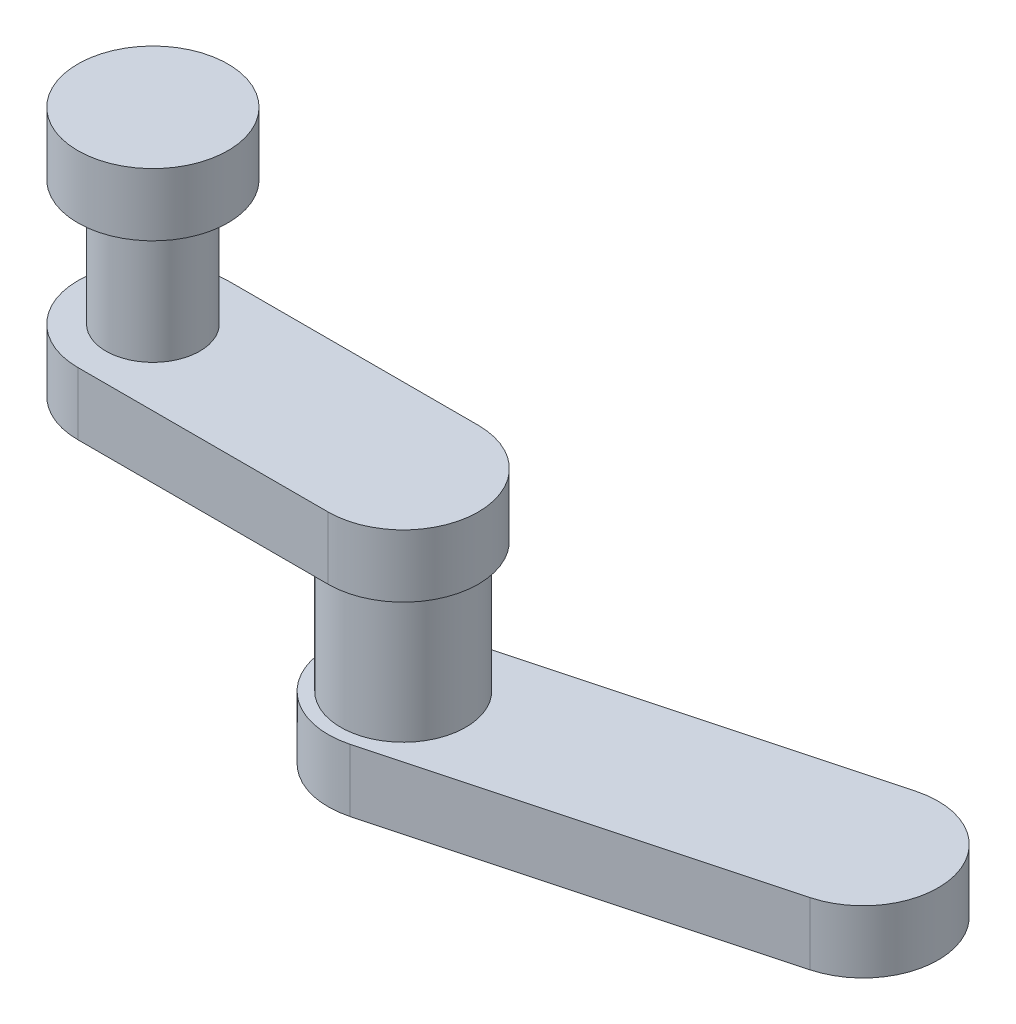
ISO-10303-21;
HEADER;
FILE_DESCRIPTION(('STEP AP214'),'2;1');
FILE_NAME('part.step','',(''),(''),'','','');
FILE_SCHEMA(('AUTOMOTIVE_DESIGN { 1 0 10303 214 1 1 1 1 }'));
ENDSEC;
DATA;
#1=APPLICATION_CONTEXT('core data for automotive mechanical design processes');
#2=APPLICATION_PROTOCOL_DEFINITION('international standard','automotive_design',2000,#1);
#3=PRODUCT_CONTEXT('',#1,'mechanical');
#4=PRODUCT('Part','Part','',(#3));
#5=PRODUCT_RELATED_PRODUCT_CATEGORY('part','',(#4));
#6=PRODUCT_DEFINITION_FORMATION('','',#4);
#7=PRODUCT_DEFINITION_CONTEXT('part definition',#1,'design');
#8=PRODUCT_DEFINITION('design','',#6,#7);
#9=PRODUCT_DEFINITION_SHAPE('','',#8);
#10=(LENGTH_UNIT() NAMED_UNIT(*) SI_UNIT(.MILLI.,.METRE.));
#11=(NAMED_UNIT(*) PLANE_ANGLE_UNIT() SI_UNIT($,.RADIAN.));
#12=(NAMED_UNIT(*) SI_UNIT($,.STERADIAN.) SOLID_ANGLE_UNIT());
#13=UNCERTAINTY_MEASURE_WITH_UNIT(LENGTH_MEASURE(1.E-05),#10,'distance_accuracy_value','');
#14=(GEOMETRIC_REPRESENTATION_CONTEXT(3) GLOBAL_UNCERTAINTY_ASSIGNED_CONTEXT((#13)) GLOBAL_UNIT_ASSIGNED_CONTEXT((#10,
#11,#12)) REPRESENTATION_CONTEXT('',''));
#15=CARTESIAN_POINT('',(0.,0.,0.));
#16=DIRECTION('',(0.,0.,1.));
#17=DIRECTION('',(1.,0.,0.));
#18=AXIS2_PLACEMENT_3D('',#15,#16,#17);
#19=CARTESIAN_POINT('',(0.,6.604,0.));
#20=DIRECTION('',(0.,-1.,0.));
#21=DIRECTION('',(0.,0.,-1.));
#22=AXIS2_PLACEMENT_3D('',#19,#20,#21);
#23=CYLINDRICAL_SURFACE('',#22,3.175);
#24=CARTESIAN_POINT('',(0.,6.604,0.));
#25=DIRECTION('',(0.,1.,0.));
#26=DIRECTION('',(0.,0.,1.));
#27=AXIS2_PLACEMENT_3D('',#24,#25,#26);
#28=CIRCLE('',#27,3.175);
#29=CARTESIAN_POINT('',(0.,6.604,-3.175));
#30=VERTEX_POINT('',#29);
#31=EDGE_CURVE('E11',#30,#30,#28,.T.);
#32=CARTESIAN_POINT('',(0.,0.,0.));
#33=DIRECTION('',(0.,1.,0.));
#34=DIRECTION('',(0.,0.,1.));
#35=AXIS2_PLACEMENT_3D('',#32,#33,#34);
#36=CIRCLE('',#35,3.175);
#37=CARTESIAN_POINT('',(0.,0.,-3.175));
#38=VERTEX_POINT('',#37);
#39=EDGE_CURVE('E44',#38,#38,#36,.T.);
#40=CARTESIAN_POINT('',(0.,6.604,-3.175));
#41=CARTESIAN_POINT('',(0.,6.53520833333333,-3.175));
#42=CARTESIAN_POINT('',(0.,6.46641666666667,-3.175));
#43=CARTESIAN_POINT('',(0.,6.32883333333333,-3.175));
#44=CARTESIAN_POINT('',(0.,6.26004166666667,-3.175));
#45=CARTESIAN_POINT('',(0.,6.12245833333333,-3.175));
#46=CARTESIAN_POINT('',(0.,6.05366666666667,-3.175));
#47=CARTESIAN_POINT('',(0.,5.91608333333333,-3.175));
#48=CARTESIAN_POINT('',(0.,5.84729166666667,-3.175));
#49=CARTESIAN_POINT('',(0.,5.70970833333333,-3.175));
#50=CARTESIAN_POINT('',(0.,5.64091666666667,-3.175));
#51=CARTESIAN_POINT('',(0.,5.50333333333333,-3.175));
#52=CARTESIAN_POINT('',(0.,5.43454166666667,-3.175));
#53=CARTESIAN_POINT('',(0.,5.29695833333333,-3.175));
#54=CARTESIAN_POINT('',(0.,5.22816666666667,-3.175));
#55=CARTESIAN_POINT('',(0.,5.09058333333333,-3.175));
#56=CARTESIAN_POINT('',(0.,5.02179166666667,-3.175));
#57=CARTESIAN_POINT('',(0.,4.88420833333333,-3.175));
#58=CARTESIAN_POINT('',(0.,4.81541666666667,-3.175));
#59=CARTESIAN_POINT('',(0.,4.67783333333333,-3.175));
#60=CARTESIAN_POINT('',(0.,4.60904166666667,-3.175));
#61=CARTESIAN_POINT('',(0.,4.47145833333333,-3.175));
#62=CARTESIAN_POINT('',(0.,4.40266666666667,-3.175));
#63=CARTESIAN_POINT('',(0.,4.26508333333333,-3.175));
#64=CARTESIAN_POINT('',(0.,4.19629166666667,-3.175));
#65=CARTESIAN_POINT('',(0.,4.05870833333333,-3.175));
#66=CARTESIAN_POINT('',(0.,3.98991666666667,-3.175));
#67=CARTESIAN_POINT('',(0.,3.85233333333333,-3.175));
#68=CARTESIAN_POINT('',(0.,3.78354166666667,-3.175));
#69=CARTESIAN_POINT('',(0.,3.64595833333333,-3.175));
#70=CARTESIAN_POINT('',(0.,3.57716666666667,-3.175));
#71=CARTESIAN_POINT('',(0.,3.43958333333333,-3.175));
#72=CARTESIAN_POINT('',(0.,3.37079166666667,-3.175));
#73=CARTESIAN_POINT('',(0.,3.23320833333333,-3.175));
#74=CARTESIAN_POINT('',(0.,3.16441666666667,-3.175));
#75=CARTESIAN_POINT('',(0.,3.02683333333333,-3.175));
#76=CARTESIAN_POINT('',(0.,2.95804166666667,-3.175));
#77=CARTESIAN_POINT('',(0.,2.82045833333333,-3.175));
#78=CARTESIAN_POINT('',(0.,2.75166666666667,-3.175));
#79=CARTESIAN_POINT('',(0.,2.61408333333333,-3.175));
#80=CARTESIAN_POINT('',(0.,2.54529166666667,-3.175));
#81=CARTESIAN_POINT('',(0.,2.40770833333333,-3.175));
#82=CARTESIAN_POINT('',(0.,2.33891666666667,-3.175));
#83=CARTESIAN_POINT('',(0.,2.20133333333333,-3.175));
#84=CARTESIAN_POINT('',(0.,2.13254166666667,-3.175));
#85=CARTESIAN_POINT('',(0.,1.99495833333333,-3.175));
#86=CARTESIAN_POINT('',(0.,1.92616666666667,-3.175));
#87=CARTESIAN_POINT('',(0.,1.78858333333333,-3.175));
#88=CARTESIAN_POINT('',(0.,1.71979166666667,-3.175));
#89=CARTESIAN_POINT('',(0.,1.58220833333333,-3.175));
#90=CARTESIAN_POINT('',(0.,1.51341666666667,-3.175));
#91=CARTESIAN_POINT('',(0.,1.37583333333333,-3.175));
#92=CARTESIAN_POINT('',(0.,1.30704166666667,-3.175));
#93=CARTESIAN_POINT('',(0.,1.16945833333333,-3.175));
#94=CARTESIAN_POINT('',(0.,1.10066666666667,-3.175));
#95=CARTESIAN_POINT('',(0.,0.963083333333333,-3.175));
#96=CARTESIAN_POINT('',(0.,0.894291666666666,-3.175));
#97=CARTESIAN_POINT('',(0.,0.756708333333333,-3.175));
#98=CARTESIAN_POINT('',(0.,0.687916666666667,-3.175));
#99=CARTESIAN_POINT('',(0.,0.550333333333333,-3.175));
#100=CARTESIAN_POINT('',(0.,0.481541666666667,-3.175));
#101=CARTESIAN_POINT('',(0.,0.343958333333333,-3.175));
#102=CARTESIAN_POINT('',(0.,0.275166666666667,-3.175));
#103=CARTESIAN_POINT('',(0.,0.137583333333333,-3.175));
#104=CARTESIAN_POINT('',(0.,0.0687916666666666,-3.175));
#105=CARTESIAN_POINT('',(0.,0.,-3.175));
#106=B_SPLINE_CURVE_WITH_KNOTS('',3,(#40,#41,#42,#43,#44,#45,#46,#47,#48,#49,#50,#51,#52,#53,
#54,#55,#56,#57,#58,#59,#60,#61,#62,#63,#64,#65,#66,#67,#68,#69,#70,#71,#72,#73,#74,#75,#76,#77,
#78,#79,#80,#81,#82,#83,#84,#85,#86,#87,#88,#89,#90,#91,#92,#93,#94,#95,#96,#97,#98,#99,#100,
#101,#102,#103,#104,#105),.UNSPECIFIED.,.F.,.F.,(4,2,2,2,2,2,2,2,2,2,2,2,2,2,2,2,2,2,2,2,2,2,2,
2,2,2,2,2,2,2,2,2,4),(0.,0.206375,0.41275,0.619125,0.8255,1.031875,1.23825,1.444625,1.651,
1.857375,2.06375,2.270125,2.4765,2.682875,2.88925,3.095625,3.302,3.508375,3.71475,3.921125,
4.1275,4.333875,4.54025,4.746625,4.953,5.159375,5.36575,5.572125,5.7785,5.984875,6.19125,
6.397625,6.604),.UNSPECIFIED.);
#107=EDGE_CURVE('BSEAM41',#30,#38,#106,.T.);
#108=ORIENTED_EDGE('',*,*,#31,.F.);
#109=ORIENTED_EDGE('',*,*,#39,.T.);
#110=ORIENTED_EDGE('',*,*,#107,.T.);
#111=ORIENTED_EDGE('',*,*,#107,.F.);
#112=EDGE_LOOP('',(#108,#110,#109,#111));
#113=FACE_BOUND('',#112,.T.);
#114=ADVANCED_FACE('F41',(#113),#23,.T.);
#115=CARTESIAN_POINT('',(0.,9.779,0.));
#116=DIRECTION('',(0.,1.,0.));
#117=DIRECTION('',(0.,0.,1.));
#118=AXIS2_PLACEMENT_3D('',#115,#116,#117);
#119=PLANE('',#118);
#120=CARTESIAN_POINT('',(0.,9.779,0.));
#121=DIRECTION('',(0.,1.,0.));
#122=DIRECTION('',(0.,0.,1.));
#123=AXIS2_PLACEMENT_3D('',#120,#121,#122);
#124=CIRCLE('',#123,3.81);
#125=CARTESIAN_POINT('',(0.,9.779,3.81));
#126=VERTEX_POINT('',#125);
#127=CARTESIAN_POINT('',(0.,9.779,-3.81));
#128=VERTEX_POINT('',#127);
#129=EDGE_CURVE('E161',#126,#128,#124,.T.);
#130=ORIENTED_EDGE('',*,*,#129,.T.);
#131=DIRECTION('',(-1.,0.,0.));
#132=VECTOR('',#131,1.);
#133=CARTESIAN_POINT('',(0.,9.779,-3.81));
#134=LINE('',#133,#132);
#135=CARTESIAN_POINT('',(-12.7,9.779,-3.81));
#136=VERTEX_POINT('',#135);
#137=EDGE_CURVE('E90',#128,#136,#134,.T.);
#138=ORIENTED_EDGE('',*,*,#137,.T.);
#139=CARTESIAN_POINT('',(-12.7,9.779,0.));
#140=DIRECTION('',(0.,1.,0.));
#141=DIRECTION('',(0.,0.,1.));
#142=AXIS2_PLACEMENT_3D('',#139,#140,#141);
#143=CIRCLE('',#142,3.81);
#144=CARTESIAN_POINT('',(-12.7,9.779,3.81));
#145=VERTEX_POINT('',#144);
#146=EDGE_CURVE('E164',#136,#145,#143,.T.);
#147=ORIENTED_EDGE('',*,*,#146,.T.);
#148=DIRECTION('',(1.,0.,0.));
#149=VECTOR('',#148,1.);
#150=CARTESIAN_POINT('',(0.,9.779,3.81));
#151=LINE('',#150,#149);
#152=EDGE_CURVE('E58',#145,#126,#151,.T.);
#153=ORIENTED_EDGE('',*,*,#152,.T.);
#154=EDGE_LOOP('',(#130,#138,#147,#153));
#155=FACE_BOUND('',#154,.T.);
#156=CARTESIAN_POINT('',(-12.7,9.779,0.));
#157=DIRECTION('',(0.,1.,0.));
#158=DIRECTION('',(0.,0.,1.));
#159=AXIS2_PLACEMENT_3D('',#156,#157,#158);
#160=CIRCLE('',#159,2.38125);
#161=CARTESIAN_POINT('',(-12.7,9.779,-2.38125));
#162=VERTEX_POINT('',#161);
#163=EDGE_CURVE('E157',#162,#162,#160,.T.);
#164=ORIENTED_EDGE('',*,*,#163,.F.);
#165=EDGE_LOOP('',(#164));
#166=FACE_BOUND('',#165,.T.);
#167=ADVANCED_FACE('F188',(#155,#166),#119,.T.);
#168=CARTESIAN_POINT('',(0.,6.604,0.));
#169=DIRECTION('',(0.,1.,0.));
#170=DIRECTION('',(0.,0.,1.));
#171=AXIS2_PLACEMENT_3D('',#168,#169,#170);
#172=PLANE('',#171);
#173=ORIENTED_EDGE('',*,*,#31,.T.);
#174=EDGE_LOOP('',(#173));
#175=FACE_BOUND('',#174,.T.);
#176=CARTESIAN_POINT('',(0.,6.604,0.));
#177=DIRECTION('',(0.,1.,0.));
#178=DIRECTION('',(0.,0.,1.));
#179=AXIS2_PLACEMENT_3D('',#176,#177,#178);
#180=CIRCLE('',#179,3.81);
#181=CARTESIAN_POINT('',(0.,6.604,3.81));
#182=VERTEX_POINT('',#181);
#183=CARTESIAN_POINT('',(0.,6.604,-3.81));
#184=VERTEX_POINT('',#183);
#185=EDGE_CURVE('E160',#182,#184,#180,.T.);
#186=ORIENTED_EDGE('',*,*,#185,.F.);
#187=DIRECTION('',(1.,0.,0.));
#188=VECTOR('',#187,1.);
#189=CARTESIAN_POINT('',(0.,6.604,3.81));
#190=LINE('',#189,#188);
#191=CARTESIAN_POINT('',(-12.7,6.604,3.81));
#192=VERTEX_POINT('',#191);
#193=EDGE_CURVE('E82',#192,#182,#190,.T.);
#194=ORIENTED_EDGE('',*,*,#193,.F.);
#195=CARTESIAN_POINT('',(-12.7,6.604,0.));
#196=DIRECTION('',(0.,1.,0.));
#197=DIRECTION('',(0.,0.,1.));
#198=AXIS2_PLACEMENT_3D('',#195,#196,#197);
#199=CIRCLE('',#198,3.81);
#200=CARTESIAN_POINT('',(-12.7,6.604,-3.81));
#201=VERTEX_POINT('',#200);
#202=EDGE_CURVE('E76',#201,#192,#199,.T.);
#203=ORIENTED_EDGE('',*,*,#202,.F.);
#204=DIRECTION('',(-1.,0.,0.));
#205=VECTOR('',#204,1.);
#206=CARTESIAN_POINT('',(0.,6.604,-3.81));
#207=LINE('',#206,#205);
#208=EDGE_CURVE('E170',#184,#201,#207,.T.);
#209=ORIENTED_EDGE('',*,*,#208,.F.);
#210=EDGE_LOOP('',(#186,#194,#203,#209));
#211=FACE_BOUND('',#210,.T.);
#212=ADVANCED_FACE('F186',(#175,#211),#172,.F.);
#213=CARTESIAN_POINT('',(0.,9.779,0.));
#214=DIRECTION('',(0.,-1.,0.));
#215=DIRECTION('',(0.,0.,-1.));
#216=AXIS2_PLACEMENT_3D('',#213,#214,#215);
#217=CYLINDRICAL_SURFACE('',#216,3.81);
#218=ORIENTED_EDGE('',*,*,#185,.T.);
#219=DIRECTION('',(0.,-1.,0.));
#220=VECTOR('',#219,1.);
#221=CARTESIAN_POINT('',(0.,9.779,-3.81));
#222=LINE('',#221,#220);
#223=EDGE_CURVE('E50',#128,#184,#222,.T.);
#224=ORIENTED_EDGE('',*,*,#223,.F.);
#225=ORIENTED_EDGE('',*,*,#129,.F.);
#226=DIRECTION('',(0.,-1.,0.));
#227=VECTOR('',#226,1.);
#228=CARTESIAN_POINT('',(0.,9.779,3.81));
#229=LINE('',#228,#227);
#230=EDGE_CURVE('E167',#126,#182,#229,.T.);
#231=ORIENTED_EDGE('',*,*,#230,.T.);
#232=EDGE_LOOP('',(#218,#224,#225,#231));
#233=FACE_BOUND('',#232,.T.);
#234=ADVANCED_FACE('F184',(#233),#217,.T.);
#235=CARTESIAN_POINT('',(0.,9.779,-3.81));
#236=DIRECTION('',(0.,0.,1.));
#237=DIRECTION('',(1.,0.,0.));
#238=AXIS2_PLACEMENT_3D('',#235,#236,#237);
#239=PLANE('',#238);
#240=ORIENTED_EDGE('',*,*,#208,.T.);
#241=DIRECTION('',(0.,-1.,0.));
#242=VECTOR('',#241,1.);
#243=CARTESIAN_POINT('',(-12.7,9.779,-3.81));
#244=LINE('',#243,#242);
#245=EDGE_CURVE('E177',#136,#201,#244,.T.);
#246=ORIENTED_EDGE('',*,*,#245,.F.);
#247=ORIENTED_EDGE('',*,*,#137,.F.);
#248=ORIENTED_EDGE('',*,*,#223,.T.);
#249=EDGE_LOOP('',(#240,#246,#247,#248));
#250=FACE_BOUND('',#249,.T.);
#251=ADVANCED_FACE('F180',(#250),#239,.F.);
#252=CARTESIAN_POINT('',(-12.7,9.779,0.));
#253=DIRECTION('',(0.,-1.,0.));
#254=DIRECTION('',(0.,0.,-1.));
#255=AXIS2_PLACEMENT_3D('',#252,#253,#254);
#256=CYLINDRICAL_SURFACE('',#255,3.81);
#257=ORIENTED_EDGE('',*,*,#202,.T.);
#258=DIRECTION('',(0.,-1.,0.));
#259=VECTOR('',#258,1.);
#260=CARTESIAN_POINT('',(-12.7,9.779,3.81));
#261=LINE('',#260,#259);
#262=EDGE_CURVE('E175',#145,#192,#261,.T.);
#263=ORIENTED_EDGE('',*,*,#262,.F.);
#264=ORIENTED_EDGE('',*,*,#146,.F.);
#265=ORIENTED_EDGE('',*,*,#245,.T.);
#266=EDGE_LOOP('',(#257,#263,#264,#265));
#267=FACE_BOUND('',#266,.T.);
#268=ADVANCED_FACE('F257',(#267),#256,.T.);
#269=CARTESIAN_POINT('',(0.,9.779,3.81));
#270=DIRECTION('',(0.,0.,-1.));
#271=DIRECTION('',(-1.,0.,0.));
#272=AXIS2_PLACEMENT_3D('',#269,#270,#271);
#273=PLANE('',#272);
#274=ORIENTED_EDGE('',*,*,#193,.T.);
#275=ORIENTED_EDGE('',*,*,#230,.F.);
#276=ORIENTED_EDGE('',*,*,#152,.F.);
#277=ORIENTED_EDGE('',*,*,#262,.T.);
#278=EDGE_LOOP('',(#274,#275,#276,#277));
#279=FACE_BOUND('',#278,.T.);
#280=ADVANCED_FACE('F253',(#279),#273,.F.);
#281=CARTESIAN_POINT('',(-12.7,16.129,0.));
#282=DIRECTION('',(0.,-1.,0.));
#283=DIRECTION('',(0.,0.,-1.));
#284=AXIS2_PLACEMENT_3D('',#281,#282,#283);
#285=CYLINDRICAL_SURFACE('',#284,2.38125);
#286=CARTESIAN_POINT('',(-12.7,16.129,0.));
#287=DIRECTION('',(0.,1.,0.));
#288=DIRECTION('',(0.,0.,1.));
#289=AXIS2_PLACEMENT_3D('',#286,#287,#288);
#290=CIRCLE('',#289,2.38125);
#291=CARTESIAN_POINT('',(-12.7,16.129,-2.38125));
#292=VERTEX_POINT('',#291);
#293=EDGE_CURVE('E152',#292,#292,#290,.T.);
#294=CARTESIAN_POINT('',(-12.7,9.779,-2.38125));
#295=CARTESIAN_POINT('',(-12.7,9.84514583333333,-2.38125));
#296=CARTESIAN_POINT('',(-12.7,9.91129166666667,-2.38125));
#297=CARTESIAN_POINT('',(-12.7,10.0435833333333,-2.38125));
#298=CARTESIAN_POINT('',(-12.7,10.1097291666667,-2.38125));
#299=CARTESIAN_POINT('',(-12.7,10.2420208333333,-2.38125));
#300=CARTESIAN_POINT('',(-12.7,10.3081666666667,-2.38125));
#301=CARTESIAN_POINT('',(-12.7,10.4404583333333,-2.38125));
#302=CARTESIAN_POINT('',(-12.7,10.5066041666667,-2.38125));
#303=CARTESIAN_POINT('',(-12.7,10.6388958333333,-2.38125));
#304=CARTESIAN_POINT('',(-12.7,10.7050416666667,-2.38125));
#305=CARTESIAN_POINT('',(-12.7,10.8373333333333,-2.38125));
#306=CARTESIAN_POINT('',(-12.7,10.9034791666667,-2.38125));
#307=CARTESIAN_POINT('',(-12.7,11.0357708333333,-2.38125));
#308=CARTESIAN_POINT('',(-12.7,11.1019166666667,-2.38125));
#309=CARTESIAN_POINT('',(-12.7,11.2342083333333,-2.38125));
#310=CARTESIAN_POINT('',(-12.7,11.3003541666667,-2.38125));
#311=CARTESIAN_POINT('',(-12.7,11.4326458333333,-2.38125));
#312=CARTESIAN_POINT('',(-12.7,11.4987916666667,-2.38125));
#313=CARTESIAN_POINT('',(-12.7,11.6310833333333,-2.38125));
#314=CARTESIAN_POINT('',(-12.7,11.6972291666667,-2.38125));
#315=CARTESIAN_POINT('',(-12.7,11.8295208333333,-2.38125));
#316=CARTESIAN_POINT('',(-12.7,11.8956666666667,-2.38125));
#317=CARTESIAN_POINT('',(-12.7,12.0279583333333,-2.38125));
#318=CARTESIAN_POINT('',(-12.7,12.0941041666667,-2.38125));
#319=CARTESIAN_POINT('',(-12.7,12.2263958333333,-2.38125));
#320=CARTESIAN_POINT('',(-12.7,12.2925416666667,-2.38125));
#321=CARTESIAN_POINT('',(-12.7,12.4248333333333,-2.38125));
#322=CARTESIAN_POINT('',(-12.7,12.4909791666667,-2.38125));
#323=CARTESIAN_POINT('',(-12.7,12.6232708333333,-2.38125));
#324=CARTESIAN_POINT('',(-12.7,12.6894166666667,-2.38125));
#325=CARTESIAN_POINT('',(-12.7,12.8217083333333,-2.38125));
#326=CARTESIAN_POINT('',(-12.7,12.8878541666667,-2.38125));
#327=CARTESIAN_POINT('',(-12.7,13.0201458333333,-2.38125));
#328=CARTESIAN_POINT('',(-12.7,13.0862916666667,-2.38125));
#329=CARTESIAN_POINT('',(-12.7,13.2185833333333,-2.38125));
#330=CARTESIAN_POINT('',(-12.7,13.2847291666667,-2.38125));
#331=CARTESIAN_POINT('',(-12.7,13.4170208333333,-2.38125));
#332=CARTESIAN_POINT('',(-12.7,13.4831666666667,-2.38125));
#333=CARTESIAN_POINT('',(-12.7,13.6154583333333,-2.38125));
#334=CARTESIAN_POINT('',(-12.7,13.6816041666667,-2.38125));
#335=CARTESIAN_POINT('',(-12.7,13.8138958333333,-2.38125));
#336=CARTESIAN_POINT('',(-12.7,13.8800416666667,-2.38125));
#337=CARTESIAN_POINT('',(-12.7,14.0123333333333,-2.38125));
#338=CARTESIAN_POINT('',(-12.7,14.0784791666667,-2.38125));
#339=CARTESIAN_POINT('',(-12.7,14.2107708333333,-2.38125));
#340=CARTESIAN_POINT('',(-12.7,14.2769166666667,-2.38125));
#341=CARTESIAN_POINT('',(-12.7,14.4092083333333,-2.38125));
#342=CARTESIAN_POINT('',(-12.7,14.4753541666667,-2.38125));
#343=CARTESIAN_POINT('',(-12.7,14.6076458333333,-2.38125));
#344=CARTESIAN_POINT('',(-12.7,14.6737916666667,-2.38125));
#345=CARTESIAN_POINT('',(-12.7,14.8060833333333,-2.38125));
#346=CARTESIAN_POINT('',(-12.7,14.8722291666667,-2.38125));
#347=CARTESIAN_POINT('',(-12.7,15.0045208333333,-2.38125));
#348=CARTESIAN_POINT('',(-12.7,15.0706666666667,-2.38125));
#349=CARTESIAN_POINT('',(-12.7,15.2029583333333,-2.38125));
#350=CARTESIAN_POINT('',(-12.7,15.2691041666667,-2.38125));
#351=CARTESIAN_POINT('',(-12.7,15.4013958333333,-2.38125));
#352=CARTESIAN_POINT('',(-12.7,15.4675416666667,-2.38125));
#353=CARTESIAN_POINT('',(-12.7,15.5998333333333,-2.38125));
#354=CARTESIAN_POINT('',(-12.7,15.6659791666667,-2.38125));
#355=CARTESIAN_POINT('',(-12.7,15.7982708333333,-2.38125));
#356=CARTESIAN_POINT('',(-12.7,15.8644166666667,-2.38125));
#357=CARTESIAN_POINT('',(-12.7,15.9967083333333,-2.38125));
#358=CARTESIAN_POINT('',(-12.7,16.0628541666667,-2.38125));
#359=CARTESIAN_POINT('',(-12.7,16.129,-2.38125));
#360=B_SPLINE_CURVE_WITH_KNOTS('',3,(#294,#295,#296,#297,#298,#299,#300,#301,#302,#303,#304,
#305,#306,#307,#308,#309,#310,#311,#312,#313,#314,#315,#316,#317,#318,#319,#320,#321,#322,#323,
#324,#325,#326,#327,#328,#329,#330,#331,#332,#333,#334,#335,#336,#337,#338,#339,#340,#341,#342,
#343,#344,#345,#346,#347,#348,#349,#350,#351,#352,#353,#354,#355,#356,#357,#358,#359),
.UNSPECIFIED.,.F.,.F.,(4,2,2,2,2,2,2,2,2,2,2,2,2,2,2,2,2,2,2,2,2,2,2,2,2,2,2,2,2,2,2,2,4),(0.,
0.198437499999999,0.396874999999998,0.5953125,0.793749999999999,0.992187499999998,1.190625,
1.3890625,1.5875,1.7859375,1.984375,2.1828125,2.38125,2.5796875,2.778125,2.9765625,3.175,
3.3734375,3.571875,3.7703125,3.96875,4.1671875,4.365625,4.5640625,4.7625,4.9609375,5.159375,
5.3578125,5.55625,5.7546875,5.953125,6.1515625,6.35),.UNSPECIFIED.);
#361=EDGE_CURVE('BSEAM251',#162,#292,#360,.T.);
#362=ORIENTED_EDGE('',*,*,#163,.T.);
#363=ORIENTED_EDGE('',*,*,#293,.F.);
#364=ORIENTED_EDGE('',*,*,#361,.T.);
#365=ORIENTED_EDGE('',*,*,#361,.F.);
#366=EDGE_LOOP('',(#362,#364,#363,#365));
#367=FACE_BOUND('',#366,.T.);
#368=ADVANCED_FACE('F251',(#367),#285,.T.);
#369=CARTESIAN_POINT('',(-12.7,19.304,0.));
#370=DIRECTION('',(0.,-1.,0.));
#371=DIRECTION('',(0.,0.,-1.));
#372=AXIS2_PLACEMENT_3D('',#369,#370,#371);
#373=CYLINDRICAL_SURFACE('',#372,3.81);
#374=CARTESIAN_POINT('',(-12.7,19.304,0.));
#375=DIRECTION('',(0.,1.,0.));
#376=DIRECTION('',(0.,0.,1.));
#377=AXIS2_PLACEMENT_3D('',#374,#375,#376);
#378=CIRCLE('',#377,3.81);
#379=CARTESIAN_POINT('',(-12.7,19.304,3.81));
#380=VERTEX_POINT('',#379);
#381=EDGE_CURVE('E149',#380,#380,#378,.T.);
#382=ORIENTED_EDGE('',*,*,#381,.F.);
#383=EDGE_LOOP('',(#382));
#384=FACE_BOUND('',#383,.T.);
#385=CARTESIAN_POINT('',(-12.7,16.129,0.));
#386=DIRECTION('',(0.,1.,0.));
#387=DIRECTION('',(0.,0.,1.));
#388=AXIS2_PLACEMENT_3D('',#385,#386,#387);
#389=CIRCLE('',#388,3.81);
#390=CARTESIAN_POINT('',(-12.7,16.129,3.81));
#391=VERTEX_POINT('',#390);
#392=EDGE_CURVE('E144',#391,#391,#389,.T.);
#393=ORIENTED_EDGE('',*,*,#392,.T.);
#394=EDGE_LOOP('',(#393));
#395=FACE_BOUND('',#394,.T.);
#396=ADVANCED_FACE('F244',(#384,#395),#373,.T.);
#397=CARTESIAN_POINT('',(-12.7,19.304,0.));
#398=DIRECTION('',(0.,1.,0.));
#399=DIRECTION('',(0.,0.,1.));
#400=AXIS2_PLACEMENT_3D('',#397,#398,#399);
#401=PLANE('',#400);
#402=ORIENTED_EDGE('',*,*,#381,.T.);
#403=EDGE_LOOP('',(#402));
#404=FACE_BOUND('',#403,.T.);
#405=ADVANCED_FACE('F241',(#404),#401,.T.);
#406=CARTESIAN_POINT('',(-12.7,16.129,0.));
#407=DIRECTION('',(0.,1.,0.));
#408=DIRECTION('',(0.,0.,1.));
#409=AXIS2_PLACEMENT_3D('',#406,#407,#408);
#410=PLANE('',#409);
#411=ORIENTED_EDGE('',*,*,#293,.T.);
#412=EDGE_LOOP('',(#411));
#413=FACE_BOUND('',#412,.T.);
#414=ORIENTED_EDGE('',*,*,#392,.F.);
#415=EDGE_LOOP('',(#414));
#416=FACE_BOUND('',#415,.T.);
#417=ADVANCED_FACE('F240',(#413,#416),#410,.F.);
#418=CARTESIAN_POINT('',(0.,-3.175,0.));
#419=DIRECTION('',(0.,1.,0.));
#420=DIRECTION('',(0.,0.,1.));
#421=AXIS2_PLACEMENT_3D('',#418,#419,#420);
#422=CYLINDRICAL_SURFACE('',#421,3.81);
#423=CARTESIAN_POINT('',(0.,0.,0.));
#424=DIRECTION('',(0.,-1.,0.));
#425=DIRECTION('',(0.,0.,-1.));
#426=AXIS2_PLACEMENT_3D('',#423,#424,#425);
#427=CIRCLE('',#426,3.81);
#428=CARTESIAN_POINT('',(0.986100561840606,0.,3.68017739816135));
#429=VERTEX_POINT('',#428);
#430=CARTESIAN_POINT('',(-0.986100561840607,0.,-3.68017739816135));
#431=VERTEX_POINT('',#430);
#432=EDGE_CURVE('E141',#429,#431,#427,.T.);
#433=ORIENTED_EDGE('',*,*,#432,.T.);
#434=DIRECTION('',(0.,1.,0.));
#435=VECTOR('',#434,1.);
#436=CARTESIAN_POINT('',(-0.986100561840607,-3.175,-3.68017739816135));
#437=LINE('',#436,#435);
#438=CARTESIAN_POINT('',(-0.986100561840607,-3.175,-3.68017739816135));
#439=VERTEX_POINT('',#438);
#440=EDGE_CURVE('E121',#439,#431,#437,.T.);
#441=ORIENTED_EDGE('',*,*,#440,.F.);
#442=CARTESIAN_POINT('',(0.,-3.175,0.));
#443=DIRECTION('',(0.,-1.,0.));
#444=DIRECTION('',(0.,0.,-1.));
#445=AXIS2_PLACEMENT_3D('',#442,#443,#444);
#446=CIRCLE('',#445,3.81);
#447=CARTESIAN_POINT('',(0.986100561840606,-3.175,3.68017739816135));
#448=VERTEX_POINT('',#447);
#449=EDGE_CURVE('E128',#448,#439,#446,.T.);
#450=ORIENTED_EDGE('',*,*,#449,.F.);
#451=DIRECTION('',(0.,1.,0.));
#452=VECTOR('',#451,1.);
#453=CARTESIAN_POINT('',(0.986100561840606,-3.175,3.68017739816135));
#454=LINE('',#453,#452);
#455=EDGE_CURVE('E222',#448,#429,#454,.T.);
#456=ORIENTED_EDGE('',*,*,#455,.T.);
#457=EDGE_LOOP('',(#433,#441,#450,#456));
#458=FACE_BOUND('',#457,.T.);
#459=ADVANCED_FACE('F139',(#458),#422,.T.);
#460=CARTESIAN_POINT('',(-0.986100561840607,-3.175,-3.68017739816135));
#461=DIRECTION('',(0.258819045102521,0.,0.965925826289068));
#462=DIRECTION('',(0.965925826289068,0.,-0.258819045102521));
#463=AXIS2_PLACEMENT_3D('',#460,#461,#462);
#464=PLANE('',#463);
#465=DIRECTION('',(0.965925826289068,0.,-0.258819045102522));
#466=VECTOR('',#465,1.);
#467=CARTESIAN_POINT('',(-0.986100561840607,0.,-3.68017739816135));
#468=LINE('',#467,#466);
#469=CARTESIAN_POINT('',(17.4147864289661,0.,-8.61068020736438));
#470=VERTEX_POINT('',#469);
#471=EDGE_CURVE('E213',#431,#470,#468,.T.);
#472=ORIENTED_EDGE('',*,*,#471,.T.);
#473=DIRECTION('',(0.,1.,0.));
#474=VECTOR('',#473,1.);
#475=CARTESIAN_POINT('',(17.4147864289661,-3.175,-8.61068020736438));
#476=LINE('',#475,#474);
#477=CARTESIAN_POINT('',(17.4147864289661,-3.175,-8.61068020736438));
#478=VERTEX_POINT('',#477);
#479=EDGE_CURVE('E124',#478,#470,#476,.T.);
#480=ORIENTED_EDGE('',*,*,#479,.F.);
#481=DIRECTION('',(0.965925826289068,0.,-0.258819045102522));
#482=VECTOR('',#481,1.);
#483=CARTESIAN_POINT('',(-0.986100561840607,-3.175,-3.68017739816135));
#484=LINE('',#483,#482);
#485=EDGE_CURVE('E117',#439,#478,#484,.T.);
#486=ORIENTED_EDGE('',*,*,#485,.F.);
#487=ORIENTED_EDGE('',*,*,#440,.T.);
#488=EDGE_LOOP('',(#472,#480,#486,#487));
#489=FACE_BOUND('',#488,.T.);
#490=ADVANCED_FACE('F119',(#489),#464,.F.);
#491=CARTESIAN_POINT('',(18.4008869908068,-3.175,-4.93050280920303));
#492=DIRECTION('',(0.,1.,0.));
#493=DIRECTION('',(0.,0.,1.));
#494=AXIS2_PLACEMENT_3D('',#491,#492,#493);
#495=CYLINDRICAL_SURFACE('',#494,3.81);
#496=CARTESIAN_POINT('',(18.4008869908068,0.,-4.93050280920303));
#497=DIRECTION('',(0.,-1.,0.));
#498=DIRECTION('',(0.,0.,-1.));
#499=AXIS2_PLACEMENT_3D('',#496,#497,#498);
#500=CIRCLE('',#499,3.81);
#501=CARTESIAN_POINT('',(19.3869875526474,0.,-1.25032541104168));
#502=VERTEX_POINT('',#501);
#503=EDGE_CURVE('E215',#470,#502,#500,.T.);
#504=ORIENTED_EDGE('',*,*,#503,.T.);
#505=DIRECTION('',(0.,1.,0.));
#506=VECTOR('',#505,1.);
#507=CARTESIAN_POINT('',(19.3869875526474,-3.175,-1.25032541104168));
#508=LINE('',#507,#506);
#509=CARTESIAN_POINT('',(19.3869875526474,-3.175,-1.25032541104168));
#510=VERTEX_POINT('',#509);
#511=EDGE_CURVE('E145',#510,#502,#508,.T.);
#512=ORIENTED_EDGE('',*,*,#511,.F.);
#513=CARTESIAN_POINT('',(18.4008869908068,-3.175,-4.93050280920303));
#514=DIRECTION('',(0.,-1.,0.));
#515=DIRECTION('',(0.,0.,-1.));
#516=AXIS2_PLACEMENT_3D('',#513,#514,#515);
#517=CIRCLE('',#516,3.81);
#518=EDGE_CURVE('E127',#478,#510,#517,.T.);
#519=ORIENTED_EDGE('',*,*,#518,.F.);
#520=ORIENTED_EDGE('',*,*,#479,.T.);
#521=EDGE_LOOP('',(#504,#512,#519,#520));
#522=FACE_BOUND('',#521,.T.);
#523=ADVANCED_FACE('F228',(#522),#495,.T.);
#524=CARTESIAN_POINT('',(0.986100561840606,-3.175,3.68017739816135));
#525=DIRECTION('',(-0.258819045102521,0.,-0.965925826289068));
#526=DIRECTION('',(-0.965925826289068,0.,0.258819045102521));
#527=AXIS2_PLACEMENT_3D('',#524,#525,#526);
#528=PLANE('',#527);
#529=DIRECTION('',(-0.965925826289068,0.,0.258819045102521));
#530=VECTOR('',#529,1.);
#531=CARTESIAN_POINT('',(0.986100561840606,0.,3.68017739816135));
#532=LINE('',#531,#530);
#533=EDGE_CURVE('E137',#502,#429,#532,.T.);
#534=ORIENTED_EDGE('',*,*,#533,.T.);
#535=ORIENTED_EDGE('',*,*,#455,.F.);
#536=DIRECTION('',(-0.965925826289068,0.,0.258819045102521));
#537=VECTOR('',#536,1.);
#538=CARTESIAN_POINT('',(0.986100561840606,-3.175,3.68017739816135));
#539=LINE('',#538,#537);
#540=EDGE_CURVE('E133',#510,#448,#539,.T.);
#541=ORIENTED_EDGE('',*,*,#540,.F.);
#542=ORIENTED_EDGE('',*,*,#511,.T.);
#543=EDGE_LOOP('',(#534,#535,#541,#542));
#544=FACE_BOUND('',#543,.T.);
#545=ADVANCED_FACE('F226',(#544),#528,.F.);
#546=CARTESIAN_POINT('',(0.,-3.175,0.));
#547=DIRECTION('',(0.,-1.,0.));
#548=DIRECTION('',(0.,0.,-1.));
#549=AXIS2_PLACEMENT_3D('',#546,#547,#548);
#550=PLANE('',#549);
#551=ORIENTED_EDGE('',*,*,#449,.T.);
#552=ORIENTED_EDGE('',*,*,#485,.T.);
#553=ORIENTED_EDGE('',*,*,#518,.T.);
#554=ORIENTED_EDGE('',*,*,#540,.T.);
#555=EDGE_LOOP('',(#551,#552,#553,#554));
#556=FACE_BOUND('',#555,.T.);
#557=ADVANCED_FACE('F131',(#556),#550,.T.);
#558=CARTESIAN_POINT('',(0.,0.,0.));
#559=DIRECTION('',(0.,-1.,0.));
#560=DIRECTION('',(0.,0.,-1.));
#561=AXIS2_PLACEMENT_3D('',#558,#559,#560);
#562=PLANE('',#561);
#563=ORIENTED_EDGE('',*,*,#39,.F.);
#564=EDGE_LOOP('',(#563));
#565=FACE_BOUND('',#564,.T.);
#566=ORIENTED_EDGE('',*,*,#432,.F.);
#567=ORIENTED_EDGE('',*,*,#533,.F.);
#568=ORIENTED_EDGE('',*,*,#503,.F.);
#569=ORIENTED_EDGE('',*,*,#471,.F.);
#570=EDGE_LOOP('',(#566,#567,#568,#569));
#571=FACE_BOUND('',#570,.T.);
#572=ADVANCED_FACE('F207',(#565,#571),#562,.F.);
#573=CLOSED_SHELL('',(#114,#167,#212,#234,#251,#268,#280,#368,#396,#405,#417,#459,#490,#523,
#545,#557,#572));
#574=MANIFOLD_SOLID_BREP('B2',#573);
#575=ADVANCED_BREP_SHAPE_REPRESENTATION('',(#18,#574),#14);
#576=SHAPE_DEFINITION_REPRESENTATION(#9,#575);
ENDSEC;
END-ISO-10303-21;
